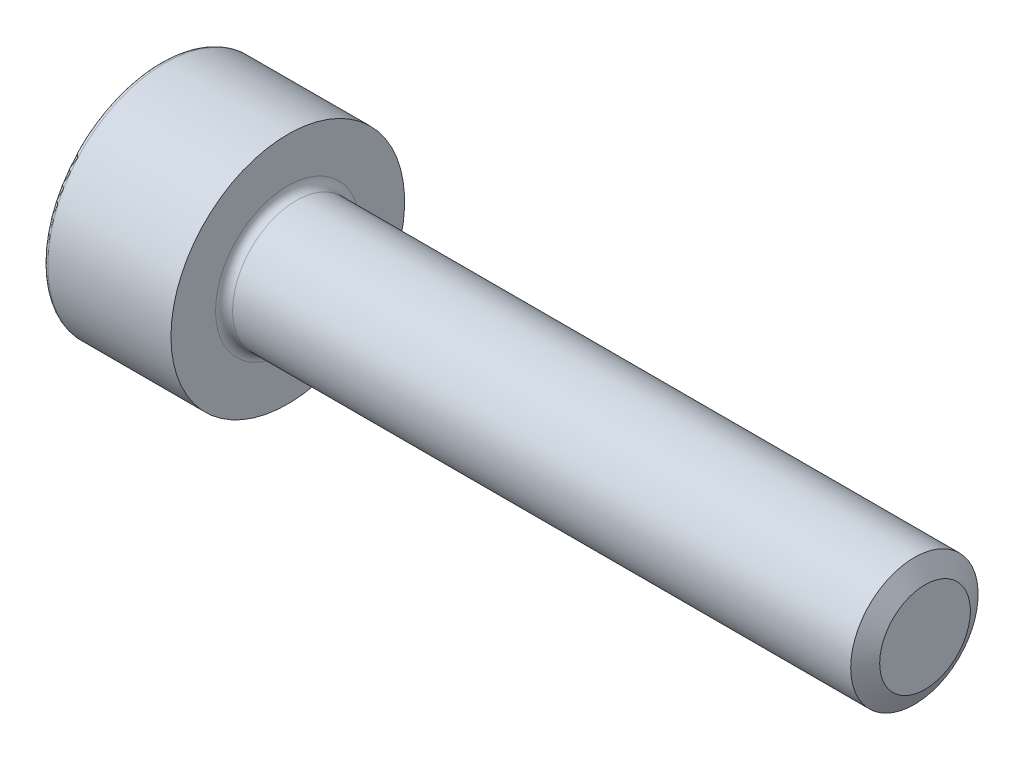
ISO-10303-21;
HEADER;
FILE_DESCRIPTION(('STEP AP214'),'2;1');
FILE_NAME('part.step','',(''),(''),'','','');
FILE_SCHEMA(('AUTOMOTIVE_DESIGN { 1 0 10303 214 1 1 1 1 }'));
ENDSEC;
DATA;
#1=APPLICATION_CONTEXT('core data for automotive mechanical design processes');
#2=APPLICATION_PROTOCOL_DEFINITION('international standard','automotive_design',2000,#1);
#3=PRODUCT_CONTEXT('',#1,'mechanical');
#4=PRODUCT('Part','Part','',(#3));
#5=PRODUCT_RELATED_PRODUCT_CATEGORY('part','',(#4));
#6=PRODUCT_DEFINITION_FORMATION('','',#4);
#7=PRODUCT_DEFINITION_CONTEXT('part definition',#1,'design');
#8=PRODUCT_DEFINITION('design','',#6,#7);
#9=PRODUCT_DEFINITION_SHAPE('','',#8);
#10=(LENGTH_UNIT() NAMED_UNIT(*) SI_UNIT(.MILLI.,.METRE.));
#11=(NAMED_UNIT(*) PLANE_ANGLE_UNIT() SI_UNIT($,.RADIAN.));
#12=(NAMED_UNIT(*) SI_UNIT($,.STERADIAN.) SOLID_ANGLE_UNIT());
#13=UNCERTAINTY_MEASURE_WITH_UNIT(LENGTH_MEASURE(1.E-05),#10,'distance_accuracy_value','');
#14=(GEOMETRIC_REPRESENTATION_CONTEXT(3) GLOBAL_UNCERTAINTY_ASSIGNED_CONTEXT((#13)) GLOBAL_UNIT_ASSIGNED_CONTEXT((#10,
#11,#12)) REPRESENTATION_CONTEXT('',''));
#15=CARTESIAN_POINT('',(0.,0.,0.));
#16=DIRECTION('',(0.,0.,1.));
#17=DIRECTION('',(1.,0.,0.));
#18=AXIS2_PLACEMENT_3D('',#15,#16,#17);
#19=CARTESIAN_POINT('',(0.,0.,0.));
#20=DIRECTION('',(-1.,0.,0.));
#21=DIRECTION('',(0.,0.,1.));
#22=AXIS2_PLACEMENT_3D('',#19,#20,#21);
#23=CYLINDRICAL_SURFACE('',#22,1.5);
#24=CARTESIAN_POINT('',(3.2,0.,0.));
#25=DIRECTION('',(-1.,0.,0.));
#26=DIRECTION('',(0.,0.,1.));
#27=AXIS2_PLACEMENT_3D('',#24,#25,#26);
#28=CIRCLE('',#27,1.5);
#29=CARTESIAN_POINT('',(3.2,0.,1.5));
#30=VERTEX_POINT('',#29);
#31=EDGE_CURVE('E148',#30,#30,#28,.T.);
#32=ORIENTED_EDGE('',*,*,#31,.F.);
#33=EDGE_LOOP('',(#32));
#34=FACE_BOUND('',#33,.T.);
#35=CARTESIAN_POINT('',(17.7500073334409,0.,0.));
#36=DIRECTION('',(-1.,0.,0.));
#37=DIRECTION('',(0.,0.,1.));
#38=AXIS2_PLACEMENT_3D('',#35,#36,#37);
#39=CIRCLE('',#38,1.5);
#40=CARTESIAN_POINT('',(17.7500073334409,0.,1.5));
#41=VERTEX_POINT('',#40);
#42=EDGE_CURVE('E285',#41,#41,#39,.T.);
#43=ORIENTED_EDGE('',*,*,#42,.T.);
#44=EDGE_LOOP('',(#43));
#45=FACE_BOUND('',#44,.T.);
#46=ADVANCED_FACE('F45',(#34,#45),#23,.T.);
#47=CARTESIAN_POINT('',(0.,0.,0.));
#48=DIRECTION('',(1.,0.,0.));
#49=DIRECTION('',(0.,0.,-1.));
#50=AXIS2_PLACEMENT_3D('',#47,#48,#49);
#51=PLANE('',#50);
#52=CARTESIAN_POINT('',(0.,0.,0.));
#53=DIRECTION('',(1.,0.,0.));
#54=DIRECTION('',(0.,0.,-1.));
#55=AXIS2_PLACEMENT_3D('',#52,#53,#54);
#56=CIRCLE('',#55,2.65);
#57=CARTESIAN_POINT('',(0.,0.,-2.65));
#58=VERTEX_POINT('',#57);
#59=EDGE_CURVE('E53',#58,#58,#56,.F.);
#60=ORIENTED_EDGE('',*,*,#59,.T.);
#61=EDGE_LOOP('',(#60));
#62=FACE_BOUND('',#61,.T.);
#63=DIRECTION('',(0.,0.866025403784439,-0.5));
#64=VECTOR('',#63,1.);
#65=CARTESIAN_POINT('',(0.,0.,1.435));
#66=LINE('',#65,#64);
#67=CARTESIAN_POINT('',(0.,0.,1.435));
#68=VERTEX_POINT('',#67);
#69=CARTESIAN_POINT('',(0.,1.24274645443067,0.717499999999999));
#70=VERTEX_POINT('',#69);
#71=EDGE_CURVE('E134',#68,#70,#66,.T.);
#72=ORIENTED_EDGE('',*,*,#71,.F.);
#73=DIRECTION('',(0.,0.866025403784439,0.5));
#74=VECTOR('',#73,1.);
#75=CARTESIAN_POINT('',(0.,-1.24274645443067,0.7175));
#76=LINE('',#75,#74);
#77=CARTESIAN_POINT('',(0.,-1.24274645443067,0.7175));
#78=VERTEX_POINT('',#77);
#79=EDGE_CURVE('E60',#78,#68,#76,.T.);
#80=ORIENTED_EDGE('',*,*,#79,.F.);
#81=DIRECTION('',(0.,0.,1.));
#82=VECTOR('',#81,1.);
#83=CARTESIAN_POINT('',(0.,-1.24274645443067,-0.7175));
#84=LINE('',#83,#82);
#85=CARTESIAN_POINT('',(0.,-1.24274645443067,-0.7175));
#86=VERTEX_POINT('',#85);
#87=EDGE_CURVE('E144',#86,#78,#84,.T.);
#88=ORIENTED_EDGE('',*,*,#87,.F.);
#89=DIRECTION('',(0.,-0.866025403784439,0.5));
#90=VECTOR('',#89,1.);
#91=CARTESIAN_POINT('',(0.,0.,-1.435));
#92=LINE('',#91,#90);
#93=CARTESIAN_POINT('',(0.,0.,-1.435));
#94=VERTEX_POINT('',#93);
#95=EDGE_CURVE('E142',#94,#86,#92,.T.);
#96=ORIENTED_EDGE('',*,*,#95,.F.);
#97=DIRECTION('',(0.,-0.866025403784439,-0.5));
#98=VECTOR('',#97,1.);
#99=CARTESIAN_POINT('',(0.,1.24274645443067,-0.7175));
#100=LINE('',#99,#98);
#101=CARTESIAN_POINT('',(0.,1.24274645443067,-0.7175));
#102=VERTEX_POINT('',#101);
#103=EDGE_CURVE('E108',#102,#94,#100,.T.);
#104=ORIENTED_EDGE('',*,*,#103,.F.);
#105=DIRECTION('',(0.,0.,-1.));
#106=VECTOR('',#105,1.);
#107=CARTESIAN_POINT('',(0.,1.24274645443067,0.717499999999999));
#108=LINE('',#107,#106);
#109=EDGE_CURVE('E138',#70,#102,#108,.T.);
#110=ORIENTED_EDGE('',*,*,#109,.F.);
#111=EDGE_LOOP('',(#72,#80,#88,#96,#104,#110));
#112=FACE_BOUND('',#111,.T.);
#113=ADVANCED_FACE('F165',(#62,#112),#51,.F.);
#114=CARTESIAN_POINT('',(0.,0.,0.));
#115=DIRECTION('',(-1.,0.,0.));
#116=DIRECTION('',(0.,0.,1.));
#117=AXIS2_PLACEMENT_3D('',#114,#115,#116);
#118=CYLINDRICAL_SURFACE('',#117,2.75);
#119=CARTESIAN_POINT('',(0.1,0.,0.));
#120=DIRECTION('',(1.,0.,0.));
#121=DIRECTION('',(0.,0.,-1.));
#122=AXIS2_PLACEMENT_3D('',#119,#120,#121);
#123=CIRCLE('',#122,2.75);
#124=CARTESIAN_POINT('',(0.1,0.,-2.75));
#125=VERTEX_POINT('',#124);
#126=EDGE_CURVE('E11',#125,#125,#123,.T.);
#127=ORIENTED_EDGE('',*,*,#126,.T.);
#128=EDGE_LOOP('',(#127));
#129=FACE_BOUND('',#128,.T.);
#130=CARTESIAN_POINT('',(3.,0.,0.));
#131=DIRECTION('',(-1.,0.,0.));
#132=DIRECTION('',(0.,0.,1.));
#133=AXIS2_PLACEMENT_3D('',#130,#131,#132);
#134=CIRCLE('',#133,2.75);
#135=CARTESIAN_POINT('',(3.,0.,2.75));
#136=VERTEX_POINT('',#135);
#137=EDGE_CURVE('E159',#136,#136,#134,.T.);
#138=ORIENTED_EDGE('',*,*,#137,.T.);
#139=EDGE_LOOP('',(#138));
#140=FACE_BOUND('',#139,.T.);
#141=ADVANCED_FACE('F184',(#129,#140),#118,.T.);
#142=CARTESIAN_POINT('',(3.,2.75,0.));
#143=DIRECTION('',(-1.,0.,0.));
#144=DIRECTION('',(0.,0.,1.));
#145=AXIS2_PLACEMENT_3D('',#142,#143,#144);
#146=PLANE('',#145);
#147=ORIENTED_EDGE('',*,*,#137,.F.);
#148=EDGE_LOOP('',(#147));
#149=FACE_BOUND('',#148,.T.);
#150=CARTESIAN_POINT('',(3.,0.,0.));
#151=DIRECTION('',(-1.,0.,0.));
#152=DIRECTION('',(0.,0.,1.));
#153=AXIS2_PLACEMENT_3D('',#150,#151,#152);
#154=CIRCLE('',#153,1.7);
#155=CARTESIAN_POINT('',(3.,0.,1.7));
#156=VERTEX_POINT('',#155);
#157=EDGE_CURVE('E156',#156,#156,#154,.T.);
#158=ORIENTED_EDGE('',*,*,#157,.T.);
#159=EDGE_LOOP('',(#158));
#160=FACE_BOUND('',#159,.T.);
#161=ADVANCED_FACE('F193',(#149,#160),#146,.F.);
#162=CARTESIAN_POINT('',(3.2,0.,0.));
#163=DIRECTION('',(-1.,0.,0.));
#164=DIRECTION('',(0.,0.,1.));
#165=AXIS2_PLACEMENT_3D('',#162,#163,#164);
#166=TOROIDAL_SURFACE('',#165,1.7,0.2);
#167=ORIENTED_EDGE('',*,*,#157,.F.);
#168=EDGE_LOOP('',(#167));
#169=FACE_BOUND('',#168,.T.);
#170=ORIENTED_EDGE('',*,*,#31,.T.);
#171=EDGE_LOOP('',(#170));
#172=FACE_BOUND('',#171,.T.);
#173=ADVANCED_FACE('F189',(#169,#172),#166,.F.);
#174=CARTESIAN_POINT('',(1.3,-1.24274645443067,0.7175));
#175=DIRECTION('',(0.,-0.5,0.866025403784439));
#176=DIRECTION('',(0.,-0.866025403784439,-0.5));
#177=AXIS2_PLACEMENT_3D('',#174,#175,#176);
#178=PLANE('',#177);
#179=ORIENTED_EDGE('',*,*,#79,.T.);
#180=DIRECTION('',(-1.,0.,0.));
#181=VECTOR('',#180,1.);
#182=CARTESIAN_POINT('',(1.3,0.,1.435));
#183=LINE('',#182,#181);
#184=CARTESIAN_POINT('',(1.3,0.,1.435));
#185=VERTEX_POINT('',#184);
#186=EDGE_CURVE('E90',#185,#68,#183,.T.);
#187=ORIENTED_EDGE('',*,*,#186,.F.);
#188=DIRECTION('',(0.,0.866025403784439,0.5));
#189=VECTOR('',#188,1.);
#190=CARTESIAN_POINT('',(1.3,-1.24274645443067,0.7175));
#191=LINE('',#190,#189);
#192=CARTESIAN_POINT('',(1.3,-1.24274645443067,0.7175));
#193=VERTEX_POINT('',#192);
#194=EDGE_CURVE('E146',#193,#185,#191,.T.);
#195=ORIENTED_EDGE('',*,*,#194,.F.);
#196=DIRECTION('',(-1.,0.,0.));
#197=VECTOR('',#196,1.);
#198=CARTESIAN_POINT('',(1.3,-1.24274645443067,0.7175));
#199=LINE('',#198,#197);
#200=EDGE_CURVE('E68',#193,#78,#199,.T.);
#201=ORIENTED_EDGE('',*,*,#200,.T.);
#202=EDGE_LOOP('',(#179,#187,#195,#201));
#203=FACE_BOUND('',#202,.T.);
#204=ADVANCED_FACE('F192',(#203),#178,.F.);
#205=CARTESIAN_POINT('',(1.3,-1.24274645443067,-0.7175));
#206=DIRECTION('',(0.,-1.,0.));
#207=DIRECTION('',(0.,0.,-1.));
#208=AXIS2_PLACEMENT_3D('',#205,#206,#207);
#209=PLANE('',#208);
#210=ORIENTED_EDGE('',*,*,#87,.T.);
#211=ORIENTED_EDGE('',*,*,#200,.F.);
#212=DIRECTION('',(0.,0.,1.));
#213=VECTOR('',#212,1.);
#214=CARTESIAN_POINT('',(1.3,-1.24274645443067,-0.7175));
#215=LINE('',#214,#213);
#216=CARTESIAN_POINT('',(1.3,-1.24274645443067,-0.7175));
#217=VERTEX_POINT('',#216);
#218=EDGE_CURVE('E120',#217,#193,#215,.T.);
#219=ORIENTED_EDGE('',*,*,#218,.F.);
#220=DIRECTION('',(-1.,0.,0.));
#221=VECTOR('',#220,1.);
#222=CARTESIAN_POINT('',(1.3,-1.24274645443067,-0.7175));
#223=LINE('',#222,#221);
#224=EDGE_CURVE('E112',#217,#86,#223,.T.);
#225=ORIENTED_EDGE('',*,*,#224,.T.);
#226=EDGE_LOOP('',(#210,#211,#219,#225));
#227=FACE_BOUND('',#226,.T.);
#228=ADVANCED_FACE('F223',(#227),#209,.F.);
#229=CARTESIAN_POINT('',(1.3,0.,-1.435));
#230=DIRECTION('',(0.,-0.5,-0.866025403784439));
#231=DIRECTION('',(0.,0.866025403784439,-0.5));
#232=AXIS2_PLACEMENT_3D('',#229,#230,#231);
#233=PLANE('',#232);
#234=ORIENTED_EDGE('',*,*,#95,.T.);
#235=ORIENTED_EDGE('',*,*,#224,.F.);
#236=DIRECTION('',(0.,-0.866025403784439,0.5));
#237=VECTOR('',#236,1.);
#238=CARTESIAN_POINT('',(1.3,0.,-1.435));
#239=LINE('',#238,#237);
#240=CARTESIAN_POINT('',(1.3,0.,-1.435));
#241=VERTEX_POINT('',#240);
#242=EDGE_CURVE('E116',#241,#217,#239,.T.);
#243=ORIENTED_EDGE('',*,*,#242,.F.);
#244=DIRECTION('',(-1.,0.,0.));
#245=VECTOR('',#244,1.);
#246=CARTESIAN_POINT('',(1.3,0.,-1.435));
#247=LINE('',#246,#245);
#248=EDGE_CURVE('E101',#241,#94,#247,.T.);
#249=ORIENTED_EDGE('',*,*,#248,.T.);
#250=EDGE_LOOP('',(#234,#235,#243,#249));
#251=FACE_BOUND('',#250,.T.);
#252=ADVANCED_FACE('F117',(#251),#233,.F.);
#253=CARTESIAN_POINT('',(1.3,1.24274645443067,-0.7175));
#254=DIRECTION('',(0.,0.5,-0.866025403784439));
#255=DIRECTION('',(0.,0.866025403784439,0.5));
#256=AXIS2_PLACEMENT_3D('',#253,#254,#255);
#257=PLANE('',#256);
#258=ORIENTED_EDGE('',*,*,#103,.T.);
#259=ORIENTED_EDGE('',*,*,#248,.F.);
#260=DIRECTION('',(0.,-0.866025403784439,-0.5));
#261=VECTOR('',#260,1.);
#262=CARTESIAN_POINT('',(1.3,1.24274645443067,-0.7175));
#263=LINE('',#262,#261);
#264=CARTESIAN_POINT('',(1.3,1.24274645443067,-0.7175));
#265=VERTEX_POINT('',#264);
#266=EDGE_CURVE('E105',#265,#241,#263,.T.);
#267=ORIENTED_EDGE('',*,*,#266,.F.);
#268=DIRECTION('',(-1.,0.,0.));
#269=VECTOR('',#268,1.);
#270=CARTESIAN_POINT('',(1.3,1.24274645443067,-0.7175));
#271=LINE('',#270,#269);
#272=EDGE_CURVE('E113',#265,#102,#271,.T.);
#273=ORIENTED_EDGE('',*,*,#272,.T.);
#274=EDGE_LOOP('',(#258,#259,#267,#273));
#275=FACE_BOUND('',#274,.T.);
#276=ADVANCED_FACE('F103',(#275),#257,.F.);
#277=CARTESIAN_POINT('',(1.3,1.24274645443067,0.717499999999999));
#278=DIRECTION('',(0.,1.,0.));
#279=DIRECTION('',(0.,0.,1.));
#280=AXIS2_PLACEMENT_3D('',#277,#278,#279);
#281=PLANE('',#280);
#282=ORIENTED_EDGE('',*,*,#109,.T.);
#283=ORIENTED_EDGE('',*,*,#272,.F.);
#284=DIRECTION('',(0.,0.,-1.));
#285=VECTOR('',#284,1.);
#286=CARTESIAN_POINT('',(1.3,1.24274645443067,0.717499999999999));
#287=LINE('',#286,#285);
#288=CARTESIAN_POINT('',(1.3,1.24274645443067,0.717499999999999));
#289=VERTEX_POINT('',#288);
#290=EDGE_CURVE('E126',#289,#265,#287,.T.);
#291=ORIENTED_EDGE('',*,*,#290,.F.);
#292=DIRECTION('',(-1.,0.,0.));
#293=VECTOR('',#292,1.);
#294=CARTESIAN_POINT('',(1.3,1.24274645443067,0.717499999999999));
#295=LINE('',#294,#293);
#296=EDGE_CURVE('E151',#289,#70,#295,.T.);
#297=ORIENTED_EDGE('',*,*,#296,.T.);
#298=EDGE_LOOP('',(#282,#283,#291,#297));
#299=FACE_BOUND('',#298,.T.);
#300=ADVANCED_FACE('F241',(#299),#281,.F.);
#301=CARTESIAN_POINT('',(1.3,0.,1.435));
#302=DIRECTION('',(0.,0.5,0.866025403784439));
#303=DIRECTION('',(0.,-0.866025403784439,0.5));
#304=AXIS2_PLACEMENT_3D('',#301,#302,#303);
#305=PLANE('',#304);
#306=ORIENTED_EDGE('',*,*,#71,.T.);
#307=ORIENTED_EDGE('',*,*,#296,.F.);
#308=DIRECTION('',(0.,0.866025403784439,-0.5));
#309=VECTOR('',#308,1.);
#310=CARTESIAN_POINT('',(1.3,0.,1.435));
#311=LINE('',#310,#309);
#312=EDGE_CURVE('E128',#185,#289,#311,.T.);
#313=ORIENTED_EDGE('',*,*,#312,.F.);
#314=ORIENTED_EDGE('',*,*,#186,.T.);
#315=EDGE_LOOP('',(#306,#307,#313,#314));
#316=FACE_BOUND('',#315,.T.);
#317=ADVANCED_FACE('F248',(#316),#305,.F.);
#318=CARTESIAN_POINT('',(1.3,-1.24274645443067,0.7175));
#319=DIRECTION('',(1.,0.,0.));
#320=DIRECTION('',(0.,0.,-1.));
#321=AXIS2_PLACEMENT_3D('',#318,#319,#320);
#322=PLANE('',#321);
#323=ORIENTED_EDGE('',*,*,#194,.T.);
#324=ORIENTED_EDGE('',*,*,#312,.T.);
#325=ORIENTED_EDGE('',*,*,#290,.T.);
#326=ORIENTED_EDGE('',*,*,#266,.T.);
#327=ORIENTED_EDGE('',*,*,#242,.T.);
#328=ORIENTED_EDGE('',*,*,#218,.T.);
#329=EDGE_LOOP('',(#323,#324,#325,#326,#327,#328));
#330=FACE_BOUND('',#329,.T.);
#331=ADVANCED_FACE('F123',(#330),#322,.F.);
#332=CARTESIAN_POINT('',(17.7500073334409,0.,0.));
#333=DIRECTION('',(-1.,0.,0.));
#334=DIRECTION('',(0.,0.,1.));
#335=AXIS2_PLACEMENT_3D('',#332,#333,#334);
#336=CONICAL_SURFACE('',#335,1.5,1.04719755119659);
#337=CARTESIAN_POINT('',(18.,0.,0.));
#338=DIRECTION('',(-1.,0.,0.));
#339=DIRECTION('',(0.,0.,1.));
#340=AXIS2_PLACEMENT_3D('',#337,#338,#339);
#341=CIRCLE('',#340,1.067);
#342=CARTESIAN_POINT('',(18.,0.,1.067));
#343=VERTEX_POINT('',#342);
#344=EDGE_CURVE('E135',#343,#343,#341,.T.);
#345=ORIENTED_EDGE('',*,*,#344,.T.);
#346=EDGE_LOOP('',(#345));
#347=FACE_BOUND('',#346,.T.);
#348=ORIENTED_EDGE('',*,*,#42,.F.);
#349=EDGE_LOOP('',(#348));
#350=FACE_BOUND('',#349,.T.);
#351=ADVANCED_FACE('F174',(#347,#350),#336,.T.);
#352=CARTESIAN_POINT('',(18.,1.5,0.));
#353=DIRECTION('',(-1.,0.,0.));
#354=DIRECTION('',(0.,0.,1.));
#355=AXIS2_PLACEMENT_3D('',#352,#353,#354);
#356=PLANE('',#355);
#357=ORIENTED_EDGE('',*,*,#344,.F.);
#358=EDGE_LOOP('',(#357));
#359=FACE_BOUND('',#358,.T.);
#360=ADVANCED_FACE('F169',(#359),#356,.F.);
#361=CARTESIAN_POINT('',(0.1,0.,0.));
#362=DIRECTION('',(1.,0.,0.));
#363=DIRECTION('',(0.,0.,-1.));
#364=AXIS2_PLACEMENT_3D('',#361,#362,#363);
#365=TOROIDAL_SURFACE('',#364,2.65,0.1);
#366=ORIENTED_EDGE('',*,*,#126,.F.);
#367=EDGE_LOOP('',(#366));
#368=FACE_BOUND('',#367,.T.);
#369=ORIENTED_EDGE('',*,*,#59,.F.);
#370=EDGE_LOOP('',(#369));
#371=FACE_BOUND('',#370,.T.);
#372=ADVANCED_FACE('F47',(#368,#371),#365,.T.);
#373=CLOSED_SHELL('',(#46,#113,#141,#161,#173,#204,#228,#252,#276,#300,#317,#331,#351,#360,#372));
#374=MANIFOLD_SOLID_BREP('B2',#373);
#375=ADVANCED_BREP_SHAPE_REPRESENTATION('',(#18,#374),#14);
#376=SHAPE_DEFINITION_REPRESENTATION(#9,#375);
ENDSEC;
END-ISO-10303-21;
